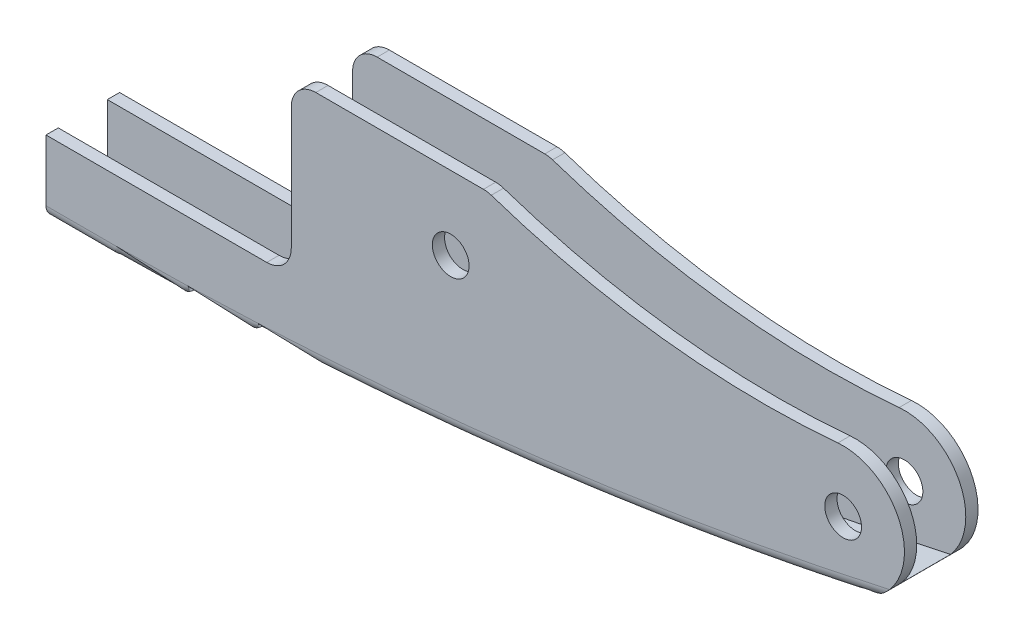
ISO-10303-21;
HEADER;
FILE_DESCRIPTION(('STEP AP214'),'2;1');
FILE_NAME('part.step','',(''),(''),'','','');
FILE_SCHEMA(('AUTOMOTIVE_DESIGN { 1 0 10303 214 1 1 1 1 }'));
ENDSEC;
DATA;
#1=APPLICATION_CONTEXT('core data for automotive mechanical design processes');
#2=APPLICATION_PROTOCOL_DEFINITION('international standard','automotive_design',2000,#1);
#3=PRODUCT_CONTEXT('',#1,'mechanical');
#4=PRODUCT('Part','Part','',(#3));
#5=PRODUCT_RELATED_PRODUCT_CATEGORY('part','',(#4));
#6=PRODUCT_DEFINITION_FORMATION('','',#4);
#7=PRODUCT_DEFINITION_CONTEXT('part definition',#1,'design');
#8=PRODUCT_DEFINITION('design','',#6,#7);
#9=PRODUCT_DEFINITION_SHAPE('','',#8);
#10=(LENGTH_UNIT() NAMED_UNIT(*) SI_UNIT(.MILLI.,.METRE.));
#11=(NAMED_UNIT(*) PLANE_ANGLE_UNIT() SI_UNIT($,.RADIAN.));
#12=(NAMED_UNIT(*) SI_UNIT($,.STERADIAN.) SOLID_ANGLE_UNIT());
#13=UNCERTAINTY_MEASURE_WITH_UNIT(LENGTH_MEASURE(1.E-05),#10,'distance_accuracy_value','');
#14=(GEOMETRIC_REPRESENTATION_CONTEXT(3) GLOBAL_UNCERTAINTY_ASSIGNED_CONTEXT((#13)) GLOBAL_UNIT_ASSIGNED_CONTEXT((#10,
#11,#12)) REPRESENTATION_CONTEXT('',''));
#15=CARTESIAN_POINT('',(0.,0.,0.));
#16=DIRECTION('',(0.,0.,1.));
#17=DIRECTION('',(1.,0.,0.));
#18=AXIS2_PLACEMENT_3D('',#15,#16,#17);
#19=CARTESIAN_POINT('',(12.7640082032885,40.1379256924185,3.));
#20=DIRECTION('',(0.,0.,-1.));
#21=DIRECTION('',(-1.,0.,0.));
#22=AXIS2_PLACEMENT_3D('',#19,#20,#21);
#23=CYLINDRICAL_SURFACE('',#22,35.);
#24=DIRECTION('',(0.,0.,-1.));
#25=VECTOR('',#24,1.);
#26=CARTESIAN_POINT('',(1.65333161323733,6.94827571367831,3.));
#27=LINE('',#26,#25);
#28=CARTESIAN_POINT('',(1.65333161323733,6.94827571367832,0.5));
#29=VERTEX_POINT('',#28);
#30=CARTESIAN_POINT('',(1.65333161323733,6.94827571367831,0.));
#31=VERTEX_POINT('',#30);
#32=EDGE_CURVE('E302',#29,#31,#27,.T.);
#33=ORIENTED_EDGE('',*,*,#32,.F.);
#34=CARTESIAN_POINT('',(12.7640082032885,40.1379256924185,0.5));
#35=DIRECTION('',(0.,0.,-1.));
#36=DIRECTION('',(-1.,0.,0.));
#37=AXIS2_PLACEMENT_3D('',#34,#35,#36);
#38=CIRCLE('',#37,35.);
#39=CARTESIAN_POINT('',(15.7842672135526,5.26848297374406,0.5));
#40=VERTEX_POINT('',#39);
#41=EDGE_CURVE('E220',#29,#40,#38,.F.);
#42=ORIENTED_EDGE('',*,*,#41,.T.);
#43=DIRECTION('',(0.,0.,-1.));
#44=VECTOR('',#43,1.);
#45=CARTESIAN_POINT('',(15.7842672135526,5.26848297374406,3.));
#46=LINE('',#45,#44);
#47=CARTESIAN_POINT('',(15.7842672135526,5.26848297374406,0.));
#48=VERTEX_POINT('',#47);
#49=EDGE_CURVE('E306',#40,#48,#46,.T.);
#50=ORIENTED_EDGE('',*,*,#49,.T.);
#51=CARTESIAN_POINT('',(12.7640082032885,40.1379256924185,0.));
#52=DIRECTION('',(0.,0.,-1.));
#53=DIRECTION('',(1.,0.,0.));
#54=AXIS2_PLACEMENT_3D('',#51,#52,#53);
#55=CIRCLE('',#54,35.);
#56=EDGE_CURVE('E254',#48,#31,#55,.T.);
#57=ORIENTED_EDGE('',*,*,#56,.T.);
#58=EDGE_LOOP('',(#33,#42,#50,#57));
#59=FACE_BOUND('',#58,.T.);
#60=ADVANCED_FACE('F34',(#59),#23,.F.);
#61=CARTESIAN_POINT('',(1.33588371066444,6.,3.));
#62=DIRECTION('',(0.,0.,-1.));
#63=DIRECTION('',(-1.,0.,0.));
#64=AXIS2_PLACEMENT_3D('',#61,#62,#63);
#65=CYLINDRICAL_SURFACE('',#64,1.00000000000002);
#66=DIRECTION('',(0.,0.,-1.));
#67=VECTOR('',#66,1.);
#68=CARTESIAN_POINT('',(1.33588371066444,7.00000000000003,3.));
#69=LINE('',#68,#67);
#70=CARTESIAN_POINT('',(1.33588371066444,7.00000000000003,0.5));
#71=VERTEX_POINT('',#70);
#72=CARTESIAN_POINT('',(1.33588371066444,7.00000000000003,0.));
#73=VERTEX_POINT('',#72);
#74=EDGE_CURVE('E298',#71,#73,#69,.T.);
#75=ORIENTED_EDGE('',*,*,#74,.F.);
#76=CARTESIAN_POINT('',(1.33588371066444,6.,0.5));
#77=DIRECTION('',(0.,0.,-1.));
#78=DIRECTION('',(-1.,0.,0.));
#79=AXIS2_PLACEMENT_3D('',#76,#77,#78);
#80=CIRCLE('',#79,1.00000000000002);
#81=EDGE_CURVE('E412',#71,#29,#80,.T.);
#82=ORIENTED_EDGE('',*,*,#81,.T.);
#83=ORIENTED_EDGE('',*,*,#32,.T.);
#84=CARTESIAN_POINT('',(1.33588371066444,6.,0.));
#85=DIRECTION('',(0.,0.,1.));
#86=DIRECTION('',(1.,0.,0.));
#87=AXIS2_PLACEMENT_3D('',#84,#85,#86);
#88=CIRCLE('',#87,1.00000000000002);
#89=EDGE_CURVE('E257',#31,#73,#88,.T.);
#90=ORIENTED_EDGE('',*,*,#89,.T.);
#91=EDGE_LOOP('',(#75,#82,#83,#90));
#92=FACE_BOUND('',#91,.T.);
#93=ADVANCED_FACE('F393',(#92),#65,.T.);
#94=CARTESIAN_POINT('',(1.33588371066444,7.00000000000003,3.));
#95=DIRECTION('',(0.,-1.,0.));
#96=DIRECTION('',(1.,0.,0.));
#97=AXIS2_PLACEMENT_3D('',#94,#95,#96);
#98=PLANE('',#97);
#99=DIRECTION('',(0.,0.,-1.));
#100=VECTOR('',#99,1.);
#101=CARTESIAN_POINT('',(-5.49999999999998,7.00000000000003,3.));
#102=LINE('',#101,#100);
#103=CARTESIAN_POINT('',(-5.49999999999998,7.00000000000003,0.5));
#104=VERTEX_POINT('',#103);
#105=CARTESIAN_POINT('',(-5.49999999999998,7.00000000000003,0.));
#106=VERTEX_POINT('',#105);
#107=EDGE_CURVE('E294',#104,#106,#102,.T.);
#108=ORIENTED_EDGE('',*,*,#107,.F.);
#109=DIRECTION('',(-1.,0.,0.));
#110=VECTOR('',#109,1.);
#111=CARTESIAN_POINT('',(-22.,7.00000000000003,0.5));
#112=LINE('',#111,#110);
#113=EDGE_CURVE('E454',#71,#104,#112,.T.);
#114=ORIENTED_EDGE('',*,*,#113,.F.);
#115=ORIENTED_EDGE('',*,*,#74,.T.);
#116=DIRECTION('',(-1.,0.,0.));
#117=VECTOR('',#116,1.);
#118=CARTESIAN_POINT('',(1.33588371066444,7.00000000000003,0.));
#119=LINE('',#118,#117);
#120=EDGE_CURVE('E260',#73,#106,#119,.T.);
#121=ORIENTED_EDGE('',*,*,#120,.T.);
#122=EDGE_LOOP('',(#108,#114,#115,#121));
#123=FACE_BOUND('',#122,.T.);
#124=ADVANCED_FACE('F390',(#123),#98,.F.);
#125=CARTESIAN_POINT('',(-5.49999999999998,6.00000000000001,3.));
#126=DIRECTION('',(0.,0.,-1.));
#127=DIRECTION('',(-1.,0.,0.));
#128=AXIS2_PLACEMENT_3D('',#125,#126,#127);
#129=CYLINDRICAL_SURFACE('',#128,1.00000000000002);
#130=DIRECTION('',(0.,0.,-1.));
#131=VECTOR('',#130,1.);
#132=CARTESIAN_POINT('',(-6.5,6.00000000000001,3.));
#133=LINE('',#132,#131);
#134=CARTESIAN_POINT('',(-6.5,6.00000000000001,0.5));
#135=VERTEX_POINT('',#134);
#136=CARTESIAN_POINT('',(-6.5,6.00000000000001,0.));
#137=VERTEX_POINT('',#136);
#138=EDGE_CURVE('E290',#135,#137,#133,.T.);
#139=ORIENTED_EDGE('',*,*,#138,.F.);
#140=CARTESIAN_POINT('',(-5.49999999999998,6.00000000000001,0.5));
#141=DIRECTION('',(0.,0.,-1.));
#142=DIRECTION('',(-1.,0.,0.));
#143=AXIS2_PLACEMENT_3D('',#140,#141,#142);
#144=CIRCLE('',#143,1.00000000000002);
#145=EDGE_CURVE('E415',#135,#104,#144,.T.);
#146=ORIENTED_EDGE('',*,*,#145,.T.);
#147=ORIENTED_EDGE('',*,*,#107,.T.);
#148=CARTESIAN_POINT('',(-5.49999999999998,6.00000000000001,0.));
#149=DIRECTION('',(0.,0.,1.));
#150=DIRECTION('',(1.,0.,0.));
#151=AXIS2_PLACEMENT_3D('',#148,#149,#150);
#152=CIRCLE('',#151,1.00000000000002);
#153=EDGE_CURVE('E263',#106,#137,#152,.T.);
#154=ORIENTED_EDGE('',*,*,#153,.T.);
#155=EDGE_LOOP('',(#139,#146,#147,#154));
#156=FACE_BOUND('',#155,.T.);
#157=ADVANCED_FACE('F386',(#156),#129,.T.);
#158=CARTESIAN_POINT('',(-6.5,6.00000000000001,3.));
#159=DIRECTION('',(1.,0.,0.));
#160=DIRECTION('',(0.,1.,0.));
#161=AXIS2_PLACEMENT_3D('',#158,#159,#160);
#162=PLANE('',#161);
#163=DIRECTION('',(0.,0.,-1.));
#164=VECTOR('',#163,1.);
#165=CARTESIAN_POINT('',(-6.5,1.,3.));
#166=LINE('',#165,#164);
#167=CARTESIAN_POINT('',(-6.5,1.,0.5));
#168=VERTEX_POINT('',#167);
#169=CARTESIAN_POINT('',(-6.5,1.,0.));
#170=VERTEX_POINT('',#169);
#171=EDGE_CURVE('E286',#168,#170,#166,.T.);
#172=ORIENTED_EDGE('',*,*,#171,.F.);
#173=DIRECTION('',(0.,1.,0.));
#174=VECTOR('',#173,1.);
#175=CARTESIAN_POINT('',(-6.5,6.00000000000001,0.5));
#176=LINE('',#175,#174);
#177=EDGE_CURVE('E418',#168,#135,#176,.T.);
#178=ORIENTED_EDGE('',*,*,#177,.T.);
#179=ORIENTED_EDGE('',*,*,#138,.T.);
#180=DIRECTION('',(0.,-1.,0.));
#181=VECTOR('',#180,1.);
#182=CARTESIAN_POINT('',(-6.5,6.00000000000001,0.));
#183=LINE('',#182,#181);
#184=EDGE_CURVE('E266',#137,#170,#183,.T.);
#185=ORIENTED_EDGE('',*,*,#184,.T.);
#186=EDGE_LOOP('',(#172,#178,#179,#185));
#187=FACE_BOUND('',#186,.T.);
#188=ADVANCED_FACE('F381',(#187),#162,.F.);
#189=CARTESIAN_POINT('',(-7.50000000000002,1.,3.));
#190=DIRECTION('',(0.,0.,-1.));
#191=DIRECTION('',(-1.,0.,0.));
#192=AXIS2_PLACEMENT_3D('',#189,#190,#191);
#193=CYLINDRICAL_SURFACE('',#192,1.00000000000002);
#194=DIRECTION('',(0.,0.,-1.));
#195=VECTOR('',#194,1.);
#196=CARTESIAN_POINT('',(-7.50000000000002,0.,3.));
#197=LINE('',#196,#195);
#198=CARTESIAN_POINT('',(-7.50000000000002,0.,0.5));
#199=VERTEX_POINT('',#198);
#200=CARTESIAN_POINT('',(-7.50000000000002,0.,0.));
#201=VERTEX_POINT('',#200);
#202=EDGE_CURVE('E282',#199,#201,#197,.T.);
#203=ORIENTED_EDGE('',*,*,#202,.F.);
#204=CARTESIAN_POINT('',(-7.50000000000002,1.,0.5));
#205=DIRECTION('',(0.,0.,-1.));
#206=DIRECTION('',(-1.,0.,0.));
#207=AXIS2_PLACEMENT_3D('',#204,#205,#206);
#208=CIRCLE('',#207,1.00000000000002);
#209=EDGE_CURVE('E423',#199,#168,#208,.F.);
#210=ORIENTED_EDGE('',*,*,#209,.T.);
#211=ORIENTED_EDGE('',*,*,#171,.T.);
#212=CARTESIAN_POINT('',(-7.50000000000002,1.,0.));
#213=DIRECTION('',(0.,0.,-1.));
#214=DIRECTION('',(-1.,0.,0.));
#215=AXIS2_PLACEMENT_3D('',#212,#213,#214);
#216=CIRCLE('',#215,1.00000000000002);
#217=EDGE_CURVE('E269',#170,#201,#216,.T.);
#218=ORIENTED_EDGE('',*,*,#217,.T.);
#219=EDGE_LOOP('',(#203,#210,#211,#218));
#220=FACE_BOUND('',#219,.T.);
#221=ADVANCED_FACE('F376',(#220),#193,.F.);
#222=CARTESIAN_POINT('',(-7.50000000000002,0.,3.));
#223=DIRECTION('',(0.,-1.,0.));
#224=DIRECTION('',(1.,0.,0.));
#225=AXIS2_PLACEMENT_3D('',#222,#223,#224);
#226=PLANE('',#225);
#227=DIRECTION('',(0.,0.,-1.));
#228=VECTOR('',#227,1.);
#229=CARTESIAN_POINT('',(-16.5,0.,3.));
#230=LINE('',#229,#228);
#231=CARTESIAN_POINT('',(-16.5,0.,0.5));
#232=VERTEX_POINT('',#231);
#233=CARTESIAN_POINT('',(-16.5,0.,0.));
#234=VERTEX_POINT('',#233);
#235=EDGE_CURVE('E278',#232,#234,#230,.T.);
#236=ORIENTED_EDGE('',*,*,#235,.F.);
#237=DIRECTION('',(1.,0.,0.));
#238=VECTOR('',#237,1.);
#239=CARTESIAN_POINT('',(-7.50000000000002,0.,0.5));
#240=LINE('',#239,#238);
#241=EDGE_CURVE('E426',#232,#199,#240,.T.);
#242=ORIENTED_EDGE('',*,*,#241,.T.);
#243=ORIENTED_EDGE('',*,*,#202,.T.);
#244=DIRECTION('',(-1.,0.,0.));
#245=VECTOR('',#244,1.);
#246=CARTESIAN_POINT('',(-7.50000000000002,0.,0.));
#247=LINE('',#246,#245);
#248=EDGE_CURVE('E272',#201,#234,#247,.T.);
#249=ORIENTED_EDGE('',*,*,#248,.T.);
#250=EDGE_LOOP('',(#236,#242,#243,#249));
#251=FACE_BOUND('',#250,.T.);
#252=ADVANCED_FACE('F371',(#251),#226,.F.);
#253=CARTESIAN_POINT('',(0.,4.00000000000003,3.));
#254=DIRECTION('',(0.,0.,-1.));
#255=DIRECTION('',(-1.,0.,0.));
#256=AXIS2_PLACEMENT_3D('',#253,#254,#255);
#257=CYLINDRICAL_SURFACE('',#256,0.749999999999999);
#258=CARTESIAN_POINT('',(0.,4.00000000000003,0.5));
#259=DIRECTION('',(0.,0.,-1.));
#260=DIRECTION('',(-1.,0.,0.));
#261=AXIS2_PLACEMENT_3D('',#258,#259,#260);
#262=CIRCLE('',#261,0.749999999999999);
#263=CARTESIAN_POINT('',(-0.749999999999999,4.00000000000003,0.5));
#264=VERTEX_POINT('',#263);
#265=EDGE_CURVE('E316',#264,#264,#262,.T.);
#266=ORIENTED_EDGE('',*,*,#265,.F.);
#267=EDGE_LOOP('',(#266));
#268=FACE_BOUND('',#267,.T.);
#269=CARTESIAN_POINT('',(0.,4.00000000000003,0.));
#270=DIRECTION('',(0.,0.,1.));
#271=DIRECTION('',(1.,0.,0.));
#272=AXIS2_PLACEMENT_3D('',#269,#270,#271);
#273=CIRCLE('',#272,0.749999999999999);
#274=CARTESIAN_POINT('',(0.749999999999999,4.00000000000003,0.));
#275=VERTEX_POINT('',#274);
#276=EDGE_CURVE('E225',#275,#275,#273,.T.);
#277=ORIENTED_EDGE('',*,*,#276,.F.);
#278=EDGE_LOOP('',(#277));
#279=FACE_BOUND('',#278,.T.);
#280=ADVANCED_FACE('F501',(#268,#279),#257,.F.);
#281=CARTESIAN_POINT('',(16.,2.77780849383874,3.));
#282=DIRECTION('',(0.,0.,-1.));
#283=DIRECTION('',(-1.,0.,0.));
#284=AXIS2_PLACEMENT_3D('',#281,#282,#283);
#285=CYLINDRICAL_SURFACE('',#284,0.749999999999998);
#286=CARTESIAN_POINT('',(16.,2.77780849383874,0.5));
#287=DIRECTION('',(0.,0.,-1.));
#288=DIRECTION('',(-1.,0.,0.));
#289=AXIS2_PLACEMENT_3D('',#286,#287,#288);
#290=CIRCLE('',#289,0.749999999999998);
#291=CARTESIAN_POINT('',(15.25,2.77780849383874,0.5));
#292=VERTEX_POINT('',#291);
#293=EDGE_CURVE('E199',#292,#292,#290,.T.);
#294=ORIENTED_EDGE('',*,*,#293,.F.);
#295=EDGE_LOOP('',(#294));
#296=FACE_BOUND('',#295,.T.);
#297=CARTESIAN_POINT('',(16.,2.77780849383874,0.));
#298=DIRECTION('',(0.,0.,1.));
#299=DIRECTION('',(1.,0.,0.));
#300=AXIS2_PLACEMENT_3D('',#297,#298,#299);
#301=CIRCLE('',#300,0.749999999999998);
#302=CARTESIAN_POINT('',(16.75,2.77780849383874,0.));
#303=VERTEX_POINT('',#302);
#304=EDGE_CURVE('E215',#303,#303,#301,.T.);
#305=ORIENTED_EDGE('',*,*,#304,.F.);
#306=EDGE_LOOP('',(#305));
#307=FACE_BOUND('',#306,.T.);
#308=ADVANCED_FACE('F506',(#296,#307),#285,.F.);
#309=CARTESIAN_POINT('',(-15.1615787135893,148.994107216234,3.));
#310=DIRECTION('',(0.,0.,1.));
#311=DIRECTION('',(1.,0.,0.));
#312=AXIS2_PLACEMENT_3D('',#309,#310,#311);
#313=PLANE('',#312);
#314=CARTESIAN_POINT('',(0.,4.00000000000003,3.));
#315=DIRECTION('',(0.,0.,1.));
#316=DIRECTION('',(1.,0.,0.));
#317=AXIS2_PLACEMENT_3D('',#314,#315,#316);
#318=CIRCLE('',#317,0.749999999999999);
#319=CARTESIAN_POINT('',(0.749999999999999,4.00000000000003,3.));
#320=VERTEX_POINT('',#319);
#321=EDGE_CURVE('E227',#320,#320,#318,.T.);
#322=ORIENTED_EDGE('',*,*,#321,.F.);
#323=EDGE_LOOP('',(#322));
#324=FACE_BOUND('',#323,.T.);
#325=DIRECTION('',(0.,-1.,0.));
#326=VECTOR('',#325,1.);
#327=CARTESIAN_POINT('',(-16.5,0.,3.));
#328=LINE('',#327,#326);
#329=CARTESIAN_POINT('',(-16.5,0.,3.));
#330=VERTEX_POINT('',#329);
#331=CARTESIAN_POINT('',(-16.5,-2.499980551111,3.));
#332=VERTEX_POINT('',#331);
#333=EDGE_CURVE('E250',#330,#332,#328,.T.);
#334=ORIENTED_EDGE('',*,*,#333,.T.);
#335=CARTESIAN_POINT('',(-15.1615787135893,148.994107216234,3.));
#336=DIRECTION('',(0.,0.,1.));
#337=DIRECTION('',(1.,0.,0.));
#338=AXIS2_PLACEMENT_3D('',#335,#336,#337);
#339=CIRCLE('',#338,151.5);
#340=CARTESIAN_POINT('',(17.8921240772023,1.14383588804895,3.));
#341=VERTEX_POINT('',#340);
#342=EDGE_CURVE('E12',#332,#341,#339,.T.);
#343=ORIENTED_EDGE('',*,*,#342,.T.);
#344=CARTESIAN_POINT('',(16.,2.77780849383874,3.));
#345=DIRECTION('',(0.,0.,1.));
#346=DIRECTION('',(1.,0.,0.));
#347=AXIS2_PLACEMENT_3D('',#344,#345,#346);
#348=CIRCLE('',#347,2.5);
#349=CARTESIAN_POINT('',(15.7842672135526,5.26848297374406,3.));
#350=VERTEX_POINT('',#349);
#351=EDGE_CURVE('E233',#341,#350,#348,.T.);
#352=ORIENTED_EDGE('',*,*,#351,.T.);
#353=CARTESIAN_POINT('',(12.7640082032885,40.1379256924185,3.));
#354=DIRECTION('',(0.,0.,-1.));
#355=DIRECTION('',(1.,0.,0.));
#356=AXIS2_PLACEMENT_3D('',#353,#354,#355);
#357=CIRCLE('',#356,35.);
#358=CARTESIAN_POINT('',(1.65333161323733,6.94827571367831,3.));
#359=VERTEX_POINT('',#358);
#360=EDGE_CURVE('E235',#350,#359,#357,.T.);
#361=ORIENTED_EDGE('',*,*,#360,.T.);
#362=CARTESIAN_POINT('',(1.33588371066444,6.,3.));
#363=DIRECTION('',(0.,0.,1.));
#364=DIRECTION('',(1.,0.,0.));
#365=AXIS2_PLACEMENT_3D('',#362,#363,#364);
#366=CIRCLE('',#365,1.00000000000002);
#367=CARTESIAN_POINT('',(1.33588371066444,7.00000000000003,3.));
#368=VERTEX_POINT('',#367);
#369=EDGE_CURVE('E238',#359,#368,#366,.T.);
#370=ORIENTED_EDGE('',*,*,#369,.T.);
#371=DIRECTION('',(-1.,0.,0.));
#372=VECTOR('',#371,1.);
#373=CARTESIAN_POINT('',(1.33588371066444,7.00000000000003,3.));
#374=LINE('',#373,#372);
#375=CARTESIAN_POINT('',(-5.49999999999998,7.00000000000003,3.));
#376=VERTEX_POINT('',#375);
#377=EDGE_CURVE('E240',#368,#376,#374,.T.);
#378=ORIENTED_EDGE('',*,*,#377,.T.);
#379=CARTESIAN_POINT('',(-5.49999999999998,6.00000000000001,3.));
#380=DIRECTION('',(0.,0.,1.));
#381=DIRECTION('',(1.,0.,0.));
#382=AXIS2_PLACEMENT_3D('',#379,#380,#381);
#383=CIRCLE('',#382,1.00000000000002);
#384=CARTESIAN_POINT('',(-6.5,6.00000000000001,3.));
#385=VERTEX_POINT('',#384);
#386=EDGE_CURVE('E242',#376,#385,#383,.T.);
#387=ORIENTED_EDGE('',*,*,#386,.T.);
#388=DIRECTION('',(0.,-1.,0.));
#389=VECTOR('',#388,1.);
#390=CARTESIAN_POINT('',(-6.5,6.00000000000001,3.));
#391=LINE('',#390,#389);
#392=CARTESIAN_POINT('',(-6.5,1.,3.));
#393=VERTEX_POINT('',#392);
#394=EDGE_CURVE('E244',#385,#393,#391,.T.);
#395=ORIENTED_EDGE('',*,*,#394,.T.);
#396=CARTESIAN_POINT('',(-7.50000000000002,1.,3.));
#397=DIRECTION('',(0.,0.,-1.));
#398=DIRECTION('',(-1.,0.,0.));
#399=AXIS2_PLACEMENT_3D('',#396,#397,#398);
#400=CIRCLE('',#399,1.00000000000002);
#401=CARTESIAN_POINT('',(-7.50000000000002,0.,3.));
#402=VERTEX_POINT('',#401);
#403=EDGE_CURVE('E246',#393,#402,#400,.T.);
#404=ORIENTED_EDGE('',*,*,#403,.T.);
#405=DIRECTION('',(-1.,0.,0.));
#406=VECTOR('',#405,1.);
#407=CARTESIAN_POINT('',(-7.50000000000002,0.,3.));
#408=LINE('',#407,#406);
#409=EDGE_CURVE('E248',#402,#330,#408,.T.);
#410=ORIENTED_EDGE('',*,*,#409,.T.);
#411=EDGE_LOOP('',(#334,#343,#352,#361,#370,#378,#387,#395,#404,#410));
#412=FACE_BOUND('',#411,.T.);
#413=CARTESIAN_POINT('',(16.,2.77780849383874,3.));
#414=DIRECTION('',(0.,0.,1.));
#415=DIRECTION('',(1.,0.,0.));
#416=AXIS2_PLACEMENT_3D('',#413,#414,#415);
#417=CIRCLE('',#416,0.749999999999998);
#418=CARTESIAN_POINT('',(16.75,2.77780849383874,3.));
#419=VERTEX_POINT('',#418);
#420=EDGE_CURVE('E218',#419,#419,#417,.T.);
#421=ORIENTED_EDGE('',*,*,#420,.F.);
#422=EDGE_LOOP('',(#421));
#423=FACE_BOUND('',#422,.T.);
#424=ADVANCED_FACE('F479',(#324,#412,#423),#313,.T.);
#425=CARTESIAN_POINT('',(-15.1615787135893,148.994107216234,0.));
#426=DIRECTION('',(0.,0.,1.));
#427=DIRECTION('',(1.,0.,0.));
#428=AXIS2_PLACEMENT_3D('',#425,#426,#427);
#429=PLANE('',#428);
#430=ORIENTED_EDGE('',*,*,#276,.T.);
#431=EDGE_LOOP('',(#430));
#432=FACE_BOUND('',#431,.T.);
#433=CARTESIAN_POINT('',(16.,2.77780849383874,0.));
#434=DIRECTION('',(0.,0.,1.));
#435=DIRECTION('',(1.,0.,0.));
#436=AXIS2_PLACEMENT_3D('',#433,#434,#435);
#437=CIRCLE('',#436,2.5);
#438=CARTESIAN_POINT('',(17.8921240772023,1.14383588804895,0.));
#439=VERTEX_POINT('',#438);
#440=EDGE_CURVE('E230',#439,#48,#437,.T.);
#441=ORIENTED_EDGE('',*,*,#440,.F.);
#442=CARTESIAN_POINT('',(-15.1615787135893,148.994107216234,0.));
#443=DIRECTION('',(0.,0.,1.));
#444=DIRECTION('',(1.,0.,0.));
#445=AXIS2_PLACEMENT_3D('',#442,#443,#444);
#446=CIRCLE('',#445,151.5);
#447=CARTESIAN_POINT('',(-16.5,-2.499980551111,0.));
#448=VERTEX_POINT('',#447);
#449=EDGE_CURVE('E58',#439,#448,#446,.F.);
#450=ORIENTED_EDGE('',*,*,#449,.T.);
#451=DIRECTION('',(0.,-1.,0.));
#452=VECTOR('',#451,1.);
#453=CARTESIAN_POINT('',(-16.5,0.,0.));
#454=LINE('',#453,#452);
#455=EDGE_CURVE('E236',#234,#448,#454,.T.);
#456=ORIENTED_EDGE('',*,*,#455,.F.);
#457=ORIENTED_EDGE('',*,*,#248,.F.);
#458=ORIENTED_EDGE('',*,*,#217,.F.);
#459=ORIENTED_EDGE('',*,*,#184,.F.);
#460=ORIENTED_EDGE('',*,*,#153,.F.);
#461=ORIENTED_EDGE('',*,*,#120,.F.);
#462=ORIENTED_EDGE('',*,*,#89,.F.);
#463=ORIENTED_EDGE('',*,*,#56,.F.);
#464=EDGE_LOOP('',(#441,#450,#456,#457,#458,#459,#460,#461,#462,#463));
#465=FACE_BOUND('',#464,.T.);
#466=ORIENTED_EDGE('',*,*,#304,.T.);
#467=EDGE_LOOP('',(#466));
#468=FACE_BOUND('',#467,.T.);
#469=ADVANCED_FACE('F343',(#432,#465,#468),#429,.F.);
#470=CARTESIAN_POINT('',(-15.1615787135893,148.994107216234,3.));
#471=DIRECTION('',(0.,0.,-1.));
#472=DIRECTION('',(-1.,0.,0.));
#473=AXIS2_PLACEMENT_3D('',#470,#471,#472);
#474=CYLINDRICAL_SURFACE('',#473,152.);
#475=DIRECTION('',(0.,0.,-1.));
#476=VECTOR('',#475,1.);
#477=CARTESIAN_POINT('',(-16.5,-3.,3.));
#478=LINE('',#477,#476);
#479=CARTESIAN_POINT('',(-16.5,-3.,2.5));
#480=VERTEX_POINT('',#479);
#481=CARTESIAN_POINT('',(-16.5,-3.,0.5));
#482=VERTEX_POINT('',#481);
#483=EDGE_CURVE('E252',#480,#482,#478,.T.);
#484=ORIENTED_EDGE('',*,*,#483,.T.);
#485=CARTESIAN_POINT('',(-15.1615787135893,148.994107216234,0.5));
#486=DIRECTION('',(0.,0.,1.));
#487=DIRECTION('',(1.,0.,0.));
#488=AXIS2_PLACEMENT_3D('',#485,#486,#487);
#489=CIRCLE('',#488,152.);
#490=CARTESIAN_POINT('',(16.5210966340065,0.332719886440828,0.5));
#491=VERTEX_POINT('',#490);
#492=EDGE_CURVE('E320',#482,#491,#489,.T.);
#493=ORIENTED_EDGE('',*,*,#492,.T.);
#494=DIRECTION('',(0.,0.,-1.));
#495=VECTOR('',#494,1.);
#496=CARTESIAN_POINT('',(16.5210966340065,0.332719886440828,3.));
#497=LINE('',#496,#495);
#498=CARTESIAN_POINT('',(16.5210966340065,0.332719886440828,2.5));
#499=VERTEX_POINT('',#498);
#500=EDGE_CURVE('E309',#499,#491,#497,.T.);
#501=ORIENTED_EDGE('',*,*,#500,.F.);
#502=CARTESIAN_POINT('',(-15.1615787135893,148.994107216234,2.5));
#503=DIRECTION('',(0.,0.,1.));
#504=DIRECTION('',(1.,0.,0.));
#505=AXIS2_PLACEMENT_3D('',#502,#503,#504);
#506=CIRCLE('',#505,152.);
#507=EDGE_CURVE('E318',#499,#480,#506,.F.);
#508=ORIENTED_EDGE('',*,*,#507,.T.);
#509=EDGE_LOOP('',(#484,#493,#501,#508));
#510=FACE_BOUND('',#509,.T.);
#511=ADVANCED_FACE('F339',(#510),#474,.T.);
#512=CARTESIAN_POINT('',(16.,2.77780849383874,3.));
#513=DIRECTION('',(0.,0.,-1.));
#514=DIRECTION('',(-1.,0.,0.));
#515=AXIS2_PLACEMENT_3D('',#512,#513,#514);
#516=CYLINDRICAL_SURFACE('',#515,2.5);
#517=ORIENTED_EDGE('',*,*,#500,.T.);
#518=CARTESIAN_POINT('',(17.8921240772023,1.14383588804888,0.));
#519=CARTESIAN_POINT('',(17.8661472342054,1.11374690952603,1.89264214271771E-05));
#520=CARTESIAN_POINT('',(17.8394723562101,1.08431587865306,0.0016825050942288));
#521=CARTESIAN_POINT('',(17.7849557999185,1.02695493388523,0.00779420182890719));
#522=CARTESIAN_POINT('',(17.7571164174433,0.999022293182348,0.012237061554263));
#523=CARTESIAN_POINT('',(17.700589363783,0.944909386598606,0.0233692571391493));
#524=CARTESIAN_POINT('',(17.6719085650823,0.91871870240744,0.0300434570089775));
#525=CARTESIAN_POINT('',(17.6136353619444,0.867919497276853,0.0452757999174147));
#526=CARTESIAN_POINT('',(17.5840423726586,0.843312023986455,0.0538351741863413));
#527=CARTESIAN_POINT('',(17.5051723884155,0.780723551727106,0.0784008227628452));
#528=CARTESIAN_POINT('',(17.4552329816929,0.744076979969206,0.0957027450201746));
#529=CARTESIAN_POINT('',(17.3536084797144,0.675066914733464,0.133383259765773));
#530=CARTESIAN_POINT('',(17.3019226640707,0.642705216506074,0.15376313422901));
#531=CARTESIAN_POINT('',(17.1442415174443,0.551720326617975,0.21842795152308));
#532=CARTESIAN_POINT('',(17.0359172757513,0.49942814670216,0.266136723618371));
#533=CARTESIAN_POINT('',(16.8608754192518,0.429676250194396,0.34498618914375));
#534=CARTESIAN_POINT('',(16.7955892010653,0.406774559505871,0.374765967656888));
#535=CARTESIAN_POINT('',(16.6637568893351,0.366551237871222,0.435002320125371));
#536=CARTESIAN_POINT('',(16.5972136841777,0.349218151826239,0.46545736514515));
#537=CARTESIAN_POINT('',(16.5271053391207,0.334006251553056,0.49727463326887));
#538=CARTESIAN_POINT('',(16.5241015436862,0.333360292650773,0.498637333622171));
#539=CARTESIAN_POINT('',(16.5210966340065,0.33271988644083,0.5));
#540=B_SPLINE_CURVE_WITH_KNOTS('',3,(#518,#519,#520,#521,#522,#523,#524,#525,#526,#527,#528,
#529,#530,#531,#532,#533,#534,#535,#536,#537,#538,#539),.UNSPECIFIED.,.F.,.F.,(4,2,2,2,2,2,2,2,
2,2,4),(0.,0.119148236942997,0.238071727100649,0.356204352886515,0.474414362531233,
0.66705000541344,0.859766103933554,1.24634899461732,1.47216446302084,1.69751239021152,
1.70759566992591),.UNSPECIFIED.);
#541=EDGE_CURVE('E329',#491,#439,#540,.F.);
#542=ORIENTED_EDGE('',*,*,#541,.T.);
#543=ORIENTED_EDGE('',*,*,#440,.T.);
#544=ORIENTED_EDGE('',*,*,#49,.F.);
#545=CARTESIAN_POINT('',(16.,2.77780849383874,0.5));
#546=DIRECTION('',(0.,0.,-1.));
#547=DIRECTION('',(-1.,0.,0.));
#548=AXIS2_PLACEMENT_3D('',#545,#546,#547);
#549=CIRCLE('',#548,2.5);
#550=CARTESIAN_POINT('',(17.8788379458635,1.12857595317511,0.5));
#551=VERTEX_POINT('',#550);
#552=EDGE_CURVE('E214',#40,#551,#549,.T.);
#553=ORIENTED_EDGE('',*,*,#552,.T.);
#554=DIRECTION('',(0.,0.,-1.));
#555=VECTOR('',#554,1.);
#556=CARTESIAN_POINT('',(17.8788379458634,1.12857595317509,1.5));
#557=LINE('',#556,#555);
#558=CARTESIAN_POINT('',(17.8788379458635,1.12857595317511,2.5));
#559=VERTEX_POINT('',#558);
#560=EDGE_CURVE('E203',#559,#551,#557,.T.);
#561=ORIENTED_EDGE('',*,*,#560,.F.);
#562=CARTESIAN_POINT('',(16.,2.77780849383874,2.5));
#563=DIRECTION('',(0.,0.,1.));
#564=DIRECTION('',(1.,0.,0.));
#565=AXIS2_PLACEMENT_3D('',#562,#563,#564);
#566=CIRCLE('',#565,2.5);
#567=CARTESIAN_POINT('',(15.7842672135526,5.26848297374406,2.5));
#568=VERTEX_POINT('',#567);
#569=EDGE_CURVE('E188',#559,#568,#566,.T.);
#570=ORIENTED_EDGE('',*,*,#569,.T.);
#571=EDGE_CURVE('E307',#350,#568,#46,.T.);
#572=ORIENTED_EDGE('',*,*,#571,.F.);
#573=ORIENTED_EDGE('',*,*,#351,.F.);
#574=CARTESIAN_POINT('',(17.8921240772023,1.14383588804888,3.));
#575=CARTESIAN_POINT('',(17.8661472342052,1.11374690952586,2.99998107357857));
#576=CARTESIAN_POINT('',(17.8394723562098,1.08431587865273,2.99831749490575));
#577=CARTESIAN_POINT('',(17.7849557999179,1.02695493388458,2.99220579817101));
#578=CARTESIAN_POINT('',(17.7571164174425,0.999022293181545,2.9877629384456));
#579=CARTESIAN_POINT('',(17.7005893637821,0.944909386597831,2.97663074286066));
#580=CARTESIAN_POINT('',(17.6719085650816,0.91871870240683,2.96995654299084));
#581=CARTESIAN_POINT('',(17.6136353619441,0.867919497276561,2.95472420008247));
#582=CARTESIAN_POINT('',(17.5840423726584,0.843312023986314,2.94616482581359));
#583=CARTESIAN_POINT('',(17.5051723884156,0.7807235517272,2.92159917723722));
#584=CARTESIAN_POINT('',(17.4552329816931,0.74407697996938,2.90429725498001));
#585=CARTESIAN_POINT('',(17.353608479715,0.67506691473379,2.86661674023433));
#586=CARTESIAN_POINT('',(17.3019226640714,0.642705216506475,2.8462368657709));
#587=CARTESIAN_POINT('',(17.1442415174445,0.551720326618152,2.78157204847778));
#588=CARTESIAN_POINT('',(17.03591727575,0.499428146701921,2.73386327638533));
#589=CARTESIAN_POINT('',(16.8608754192527,0.429676250194588,2.65501381085415));
#590=CARTESIAN_POINT('',(16.795589201068,0.406774559506467,2.62523403233668));
#591=CARTESIAN_POINT('',(16.6637568893324,0.366551237870641,2.56499767988081));
#592=CARTESIAN_POINT('',(16.5972136841677,0.349218151824079,2.53454263487792));
#593=CARTESIAN_POINT('',(16.5271053391198,0.334006251552872,2.50272536673317));
#594=CARTESIAN_POINT('',(16.5241015436858,0.333360292650677,2.50136266637889));
#595=CARTESIAN_POINT('',(16.5210966340065,0.33271988644083,2.5));
#596=B_SPLINE_CURVE_WITH_KNOTS('',3,(#574,#575,#576,#577,#578,#579,#580,#581,#582,#583,#584,
#585,#586,#587,#588,#589,#590,#591,#592,#593,#594,#595),.UNSPECIFIED.,.F.,.F.,(4,2,2,2,2,2,2,2,
2,2,4),(0.,0.119148236943669,0.238071727102032,0.356204352887221,0.474414362531232,
0.667050005412955,0.859766103932677,1.24634899461732,1.47216446302089,1.69751239021147,
1.70759566992591),.UNSPECIFIED.);
#597=EDGE_CURVE('E323',#341,#499,#596,.T.);
#598=ORIENTED_EDGE('',*,*,#597,.T.);
#599=EDGE_LOOP('',(#517,#542,#543,#544,#553,#561,#570,#572,#573,#598));
#600=FACE_BOUND('',#599,.T.);
#601=ADVANCED_FACE('F212',(#600),#516,.T.);
#602=ORIENTED_EDGE('',*,*,#571,.T.);
#603=CARTESIAN_POINT('',(12.7640082032885,40.1379256924185,2.5));
#604=DIRECTION('',(0.,0.,1.));
#605=DIRECTION('',(1.,0.,0.));
#606=AXIS2_PLACEMENT_3D('',#603,#604,#605);
#607=CIRCLE('',#606,35.);
#608=CARTESIAN_POINT('',(1.65333161323733,6.94827571367832,2.5));
#609=VERTEX_POINT('',#608);
#610=EDGE_CURVE('E194',#568,#609,#607,.F.);
#611=ORIENTED_EDGE('',*,*,#610,.T.);
#612=EDGE_CURVE('E303',#359,#609,#27,.T.);
#613=ORIENTED_EDGE('',*,*,#612,.F.);
#614=ORIENTED_EDGE('',*,*,#360,.F.);
#615=EDGE_LOOP('',(#602,#611,#613,#614));
#616=FACE_BOUND('',#615,.T.);
#617=ADVANCED_FACE('F338',(#616),#23,.F.);
#618=ORIENTED_EDGE('',*,*,#612,.T.);
#619=CARTESIAN_POINT('',(1.33588371066444,6.,2.5));
#620=DIRECTION('',(0.,0.,1.));
#621=DIRECTION('',(1.,0.,0.));
#622=AXIS2_PLACEMENT_3D('',#619,#620,#621);
#623=CIRCLE('',#622,1.00000000000002);
#624=CARTESIAN_POINT('',(1.33588371066444,7.00000000000003,2.5));
#625=VERTEX_POINT('',#624);
#626=EDGE_CURVE('E435',#609,#625,#623,.T.);
#627=ORIENTED_EDGE('',*,*,#626,.T.);
#628=EDGE_CURVE('E299',#368,#625,#69,.T.);
#629=ORIENTED_EDGE('',*,*,#628,.F.);
#630=ORIENTED_EDGE('',*,*,#369,.F.);
#631=EDGE_LOOP('',(#618,#627,#629,#630));
#632=FACE_BOUND('',#631,.T.);
#633=ADVANCED_FACE('F388',(#632),#65,.T.);
#634=ORIENTED_EDGE('',*,*,#628,.T.);
#635=DIRECTION('',(1.,0.,0.));
#636=VECTOR('',#635,1.);
#637=CARTESIAN_POINT('',(-22.,7.00000000000003,2.5));
#638=LINE('',#637,#636);
#639=CARTESIAN_POINT('',(-5.49999999999998,7.00000000000003,2.5));
#640=VERTEX_POINT('',#639);
#641=EDGE_CURVE('E456',#640,#625,#638,.T.);
#642=ORIENTED_EDGE('',*,*,#641,.F.);
#643=EDGE_CURVE('E295',#376,#640,#102,.T.);
#644=ORIENTED_EDGE('',*,*,#643,.F.);
#645=ORIENTED_EDGE('',*,*,#377,.F.);
#646=EDGE_LOOP('',(#634,#642,#644,#645));
#647=FACE_BOUND('',#646,.T.);
#648=ADVANCED_FACE('F384',(#647),#98,.F.);
#649=ORIENTED_EDGE('',*,*,#643,.T.);
#650=CARTESIAN_POINT('',(-5.49999999999998,6.00000000000001,2.5));
#651=DIRECTION('',(0.,0.,1.));
#652=DIRECTION('',(1.,0.,0.));
#653=AXIS2_PLACEMENT_3D('',#650,#651,#652);
#654=CIRCLE('',#653,1.00000000000002);
#655=CARTESIAN_POINT('',(-6.5,6.00000000000001,2.5));
#656=VERTEX_POINT('',#655);
#657=EDGE_CURVE('E438',#640,#656,#654,.T.);
#658=ORIENTED_EDGE('',*,*,#657,.T.);
#659=EDGE_CURVE('E291',#385,#656,#133,.T.);
#660=ORIENTED_EDGE('',*,*,#659,.F.);
#661=ORIENTED_EDGE('',*,*,#386,.F.);
#662=EDGE_LOOP('',(#649,#658,#660,#661));
#663=FACE_BOUND('',#662,.T.);
#664=ADVANCED_FACE('F379',(#663),#129,.T.);
#665=ORIENTED_EDGE('',*,*,#659,.T.);
#666=DIRECTION('',(0.,-1.,0.));
#667=VECTOR('',#666,1.);
#668=CARTESIAN_POINT('',(-6.5,6.00000000000001,2.5));
#669=LINE('',#668,#667);
#670=CARTESIAN_POINT('',(-6.5,1.,2.5));
#671=VERTEX_POINT('',#670);
#672=EDGE_CURVE('E441',#656,#671,#669,.T.);
#673=ORIENTED_EDGE('',*,*,#672,.T.);
#674=EDGE_CURVE('E287',#393,#671,#166,.T.);
#675=ORIENTED_EDGE('',*,*,#674,.F.);
#676=ORIENTED_EDGE('',*,*,#394,.F.);
#677=EDGE_LOOP('',(#665,#673,#675,#676));
#678=FACE_BOUND('',#677,.T.);
#679=ADVANCED_FACE('F374',(#678),#162,.F.);
#680=ORIENTED_EDGE('',*,*,#674,.T.);
#681=CARTESIAN_POINT('',(-7.50000000000002,1.,2.5));
#682=DIRECTION('',(0.,0.,1.));
#683=DIRECTION('',(1.,0.,0.));
#684=AXIS2_PLACEMENT_3D('',#681,#682,#683);
#685=CIRCLE('',#684,1.00000000000002);
#686=CARTESIAN_POINT('',(-7.50000000000002,0.,2.5));
#687=VERTEX_POINT('',#686);
#688=EDGE_CURVE('E444',#671,#687,#685,.F.);
#689=ORIENTED_EDGE('',*,*,#688,.T.);
#690=EDGE_CURVE('E283',#402,#687,#197,.T.);
#691=ORIENTED_EDGE('',*,*,#690,.F.);
#692=ORIENTED_EDGE('',*,*,#403,.F.);
#693=EDGE_LOOP('',(#680,#689,#691,#692));
#694=FACE_BOUND('',#693,.T.);
#695=ADVANCED_FACE('F369',(#694),#193,.F.);
#696=ORIENTED_EDGE('',*,*,#690,.T.);
#697=DIRECTION('',(-1.,0.,0.));
#698=VECTOR('',#697,1.);
#699=CARTESIAN_POINT('',(-7.50000000000002,0.,2.5));
#700=LINE('',#699,#698);
#701=CARTESIAN_POINT('',(-16.5,0.,2.5));
#702=VERTEX_POINT('',#701);
#703=EDGE_CURVE('E447',#687,#702,#700,.T.);
#704=ORIENTED_EDGE('',*,*,#703,.T.);
#705=EDGE_CURVE('E279',#330,#702,#230,.T.);
#706=ORIENTED_EDGE('',*,*,#705,.F.);
#707=ORIENTED_EDGE('',*,*,#409,.F.);
#708=EDGE_LOOP('',(#696,#704,#706,#707));
#709=FACE_BOUND('',#708,.T.);
#710=ADVANCED_FACE('F364',(#709),#226,.F.);
#711=CARTESIAN_POINT('',(-16.5,0.,3.));
#712=DIRECTION('',(1.,0.,0.));
#713=DIRECTION('',(0.,0.,-1.));
#714=AXIS2_PLACEMENT_3D('',#711,#712,#713);
#715=PLANE('',#714);
#716=ORIENTED_EDGE('',*,*,#455,.T.);
#717=CARTESIAN_POINT('',(-16.5,-2.499980551111,0.));
#718=CARTESIAN_POINT('',(-16.5,-2.52811158672559,-2.38871277689081E-05));
#719=CARTESIAN_POINT('',(-16.5,-2.55623549128955,0.00237245162543082));
#720=CARTESIAN_POINT('',(-16.5,-2.61166627351936,0.0118293212823411));
#721=CARTESIAN_POINT('',(-16.5,-2.63897377359375,0.0188861991439828));
#722=CARTESIAN_POINT('',(-16.5,-2.69202822456437,0.0374928648780822));
#723=CARTESIAN_POINT('',(-16.5,-2.71777441883783,0.0490448113049409));
#724=CARTESIAN_POINT('',(-16.5,-2.76695780629253,0.0763036748108299));
#725=CARTESIAN_POINT('',(-16.5,-2.79039540602042,0.0920098585212077));
#726=CARTESIAN_POINT('',(-16.5,-2.83430053698443,0.127133702964048));
#727=CARTESIAN_POINT('',(-16.5,-2.8547681488103,0.146551262956244));
#728=CARTESIAN_POINT('',(-16.5,-2.89215692736153,0.188551555776015));
#729=CARTESIAN_POINT('',(-16.5,-2.90907739979103,0.211134906815791));
#730=CARTESIAN_POINT('',(-16.5,-2.93888821860753,0.258823293809035));
#731=CARTESIAN_POINT('',(-16.5,-2.95177792402831,0.283928729982714));
#732=CARTESIAN_POINT('',(-16.5,-2.97315268856546,0.335942373429623));
#733=CARTESIAN_POINT('',(-16.5,-2.98164033021738,0.362849513220599));
#734=CARTESIAN_POINT('',(-16.5,-2.99186001421198,0.408267847012018));
#735=CARTESIAN_POINT('',(-16.5,-2.99491066416288,0.426493256666106));
#736=CARTESIAN_POINT('',(-16.5,-2.99898038802383,0.46314323000429));
#737=CARTESIAN_POINT('',(-16.5,-3.00000234173318,0.481567474001935));
#738=CARTESIAN_POINT('',(-16.5,-2.99999999999999,0.500000000000003));
#739=B_SPLINE_CURVE_WITH_KNOTS('',3,(#717,#718,#719,#720,#721,#722,#723,#724,#725,#726,#727,
#728,#729,#730,#731,#732,#733,#734,#735,#736,#737,#738),.UNSPECIFIED.,.F.,.F.,(4,2,2,2,2,2,2,2,
2,2,4),(0.,0.0842810077438258,0.168496032297617,0.25275154733378,0.336992198231035,
0.421230562854925,0.505485400429111,0.589753629269761,0.673972364832218,0.729304110394124,
0.784557254443688),.UNSPECIFIED.);
#740=EDGE_CURVE('E43',#448,#482,#739,.T.);
#741=ORIENTED_EDGE('',*,*,#740,.T.);
#742=ORIENTED_EDGE('',*,*,#483,.F.);
#743=CARTESIAN_POINT('',(-16.5,-3.,2.5));
#744=CARTESIAN_POINT('',(-16.5,-3.00002389536127,2.52812835608096));
#745=CARTESIAN_POINT('',(-16.5,-2.99762772419176,2.55624956826044));
#746=CARTESIAN_POINT('',(-16.5,-2.98817158540357,2.61167495761785));
#747=CARTESIAN_POINT('',(-16.5,-2.98111528096471,2.63897975894242));
#748=CARTESIAN_POINT('',(-16.5,-2.96251024064127,2.69202892880065));
#749=CARTESIAN_POINT('',(-16.5,-2.95095934986757,2.71777254198326));
#750=CARTESIAN_POINT('',(-16.5,-2.92370315726282,2.76695108554798));
#751=CARTESIAN_POINT('',(-16.5,-2.90799858609429,2.79038642097882));
#752=CARTESIAN_POINT('',(-16.5,-2.8728779698857,2.83428831639711));
#753=CARTESIAN_POINT('',(-16.5,-2.85346189734586,2.85475485438574));
#754=CARTESIAN_POINT('',(-16.5,-2.81146496818849,2.89214203886074));
#755=CARTESIAN_POINT('',(-16.5,-2.78888349297821,2.90906199064569));
#756=CARTESIAN_POINT('',(-16.5,-2.74119741886424,2.93887366897919));
#757=CARTESIAN_POINT('',(-16.5,-2.71609223519719,2.95176445908237));
#758=CARTESIAN_POINT('',(-16.5,-2.66407900595888,2.97314176309394));
#759=CARTESIAN_POINT('',(-16.5,-2.63717202589457,2.98163085446091));
#760=CARTESIAN_POINT('',(-16.5,-2.59174717334523,2.99185480464047));
#761=CARTESIAN_POINT('',(-16.5,-2.57351498657203,2.99490740688575));
#762=CARTESIAN_POINT('',(-16.5,-2.53685126378923,2.99897973647453));
#763=CARTESIAN_POINT('',(-16.5,-2.51842004774142,3.00000234533239));
#764=CARTESIAN_POINT('',(-16.5,-2.499980551111,3.));
#765=B_SPLINE_CURVE_WITH_KNOTS('',3,(#743,#744,#745,#746,#747,#748,#749,#750,#751,#752,#753,
#754,#755,#756,#757,#758,#759,#760,#761,#762,#763,#764),.UNSPECIFIED.,.F.,.F.,(4,2,2,2,2,2,2,2,
2,2,4),(0.,0.0842729527898964,0.168479740063053,0.25272694936856,0.336959348823647,
0.421192372409534,0.505441880080692,0.589710954228123,0.673930627894797,0.729283288963267,
0.784557322255792),.UNSPECIFIED.);
#766=EDGE_CURVE('E50',#480,#332,#765,.T.);
#767=ORIENTED_EDGE('',*,*,#766,.T.);
#768=ORIENTED_EDGE('',*,*,#333,.F.);
#769=ORIENTED_EDGE('',*,*,#705,.T.);
#770=DIRECTION('',(0.,-1.,0.));
#771=VECTOR('',#770,1.);
#772=CARTESIAN_POINT('',(-16.5,0.,2.5));
#773=LINE('',#772,#771);
#774=CARTESIAN_POINT('',(-16.5,-2.5,2.5));
#775=VERTEX_POINT('',#774);
#776=EDGE_CURVE('E450',#702,#775,#773,.T.);
#777=ORIENTED_EDGE('',*,*,#776,.T.);
#778=DIRECTION('',(0.,0.,-1.));
#779=VECTOR('',#778,1.);
#780=CARTESIAN_POINT('',(-16.5,-2.5,3.));
#781=LINE('',#780,#779);
#782=CARTESIAN_POINT('',(-16.5,-2.5,0.5));
#783=VERTEX_POINT('',#782);
#784=EDGE_CURVE('E206',#783,#775,#781,.F.);
#785=ORIENTED_EDGE('',*,*,#784,.F.);
#786=DIRECTION('',(0.,1.,0.));
#787=VECTOR('',#786,1.);
#788=CARTESIAN_POINT('',(-16.5,0.,0.5));
#789=LINE('',#788,#787);
#790=EDGE_CURVE('E429',#783,#232,#789,.T.);
#791=ORIENTED_EDGE('',*,*,#790,.T.);
#792=ORIENTED_EDGE('',*,*,#235,.T.);
#793=EDGE_LOOP('',(#716,#741,#742,#767,#768,#769,#777,#785,#791,#792));
#794=FACE_BOUND('',#793,.T.);
#795=ADVANCED_FACE('F358',(#794),#715,.F.);
#796=CARTESIAN_POINT('',(0.,4.00000000000003,2.5));
#797=DIRECTION('',(0.,0.,1.));
#798=DIRECTION('',(1.,0.,0.));
#799=AXIS2_PLACEMENT_3D('',#796,#797,#798);
#800=CIRCLE('',#799,0.749999999999999);
#801=CARTESIAN_POINT('',(0.749999999999999,4.00000000000003,2.5));
#802=VERTEX_POINT('',#801);
#803=EDGE_CURVE('E313',#802,#802,#800,.T.);
#804=ORIENTED_EDGE('',*,*,#803,.F.);
#805=EDGE_LOOP('',(#804));
#806=FACE_BOUND('',#805,.T.);
#807=ORIENTED_EDGE('',*,*,#321,.T.);
#808=EDGE_LOOP('',(#807));
#809=FACE_BOUND('',#808,.T.);
#810=ADVANCED_FACE('F363',(#806,#809),#257,.F.);
#811=CARTESIAN_POINT('',(16.,2.77780849383874,2.5));
#812=DIRECTION('',(0.,0.,1.));
#813=DIRECTION('',(1.,0.,0.));
#814=AXIS2_PLACEMENT_3D('',#811,#812,#813);
#815=CIRCLE('',#814,0.749999999999998);
#816=CARTESIAN_POINT('',(16.75,2.77780849383874,2.5));
#817=VERTEX_POINT('',#816);
#818=EDGE_CURVE('E207',#817,#817,#815,.T.);
#819=ORIENTED_EDGE('',*,*,#818,.F.);
#820=EDGE_LOOP('',(#819));
#821=FACE_BOUND('',#820,.T.);
#822=ORIENTED_EDGE('',*,*,#420,.T.);
#823=EDGE_LOOP('',(#822));
#824=FACE_BOUND('',#823,.T.);
#825=ADVANCED_FACE('F538',(#821,#824),#285,.F.);
#826=CARTESIAN_POINT('',(-15.1615787135893,149.494107216234,3.));
#827=DIRECTION('',(0.,0.,-1.));
#828=DIRECTION('',(-1.,0.,0.));
#829=AXIS2_PLACEMENT_3D('',#826,#827,#828);
#830=CYLINDRICAL_SURFACE('',#829,152.);
#831=ORIENTED_EDGE('',*,*,#560,.T.);
#832=CARTESIAN_POINT('',(-15.1615787135893,149.494107216234,0.5));
#833=DIRECTION('',(0.,0.,-1.));
#834=DIRECTION('',(-1.,0.,0.));
#835=AXIS2_PLACEMENT_3D('',#832,#833,#834);
#836=CIRCLE('',#835,152.);
#837=EDGE_CURVE('E208',#783,#551,#836,.F.);
#838=ORIENTED_EDGE('',*,*,#837,.F.);
#839=ORIENTED_EDGE('',*,*,#784,.T.);
#840=CARTESIAN_POINT('',(-15.1615787135893,149.494107216234,2.5));
#841=DIRECTION('',(0.,0.,1.));
#842=DIRECTION('',(1.,0.,0.));
#843=AXIS2_PLACEMENT_3D('',#840,#841,#842);
#844=CIRCLE('',#843,152.);
#845=EDGE_CURVE('E191',#559,#775,#844,.F.);
#846=ORIENTED_EDGE('',*,*,#845,.F.);
#847=EDGE_LOOP('',(#831,#838,#839,#846));
#848=FACE_BOUND('',#847,.T.);
#849=ADVANCED_FACE('F202',(#848),#830,.F.);
#850=CARTESIAN_POINT('',(-22.,-4.00689278376584,0.5));
#851=DIRECTION('',(0.,0.,-1.));
#852=DIRECTION('',(-1.,0.,0.));
#853=AXIS2_PLACEMENT_3D('',#850,#851,#852);
#854=PLANE('',#853);
#855=ORIENTED_EDGE('',*,*,#265,.T.);
#856=EDGE_LOOP('',(#855));
#857=FACE_BOUND('',#856,.T.);
#858=ORIENTED_EDGE('',*,*,#293,.T.);
#859=EDGE_LOOP('',(#858));
#860=FACE_BOUND('',#859,.T.);
#861=ORIENTED_EDGE('',*,*,#41,.F.);
#862=ORIENTED_EDGE('',*,*,#81,.F.);
#863=ORIENTED_EDGE('',*,*,#113,.T.);
#864=ORIENTED_EDGE('',*,*,#145,.F.);
#865=ORIENTED_EDGE('',*,*,#177,.F.);
#866=ORIENTED_EDGE('',*,*,#209,.F.);
#867=ORIENTED_EDGE('',*,*,#241,.F.);
#868=ORIENTED_EDGE('',*,*,#790,.F.);
#869=ORIENTED_EDGE('',*,*,#837,.T.);
#870=ORIENTED_EDGE('',*,*,#552,.F.);
#871=EDGE_LOOP('',(#861,#862,#863,#864,#865,#866,#867,#868,#869,#870));
#872=FACE_BOUND('',#871,.T.);
#873=ADVANCED_FACE('F459',(#857,#860,#872),#854,.F.);
#874=CARTESIAN_POINT('',(-22.,-4.00689278376584,2.5));
#875=DIRECTION('',(0.,0.,1.));
#876=DIRECTION('',(1.,0.,0.));
#877=AXIS2_PLACEMENT_3D('',#874,#875,#876);
#878=PLANE('',#877);
#879=ORIENTED_EDGE('',*,*,#803,.T.);
#880=EDGE_LOOP('',(#879));
#881=FACE_BOUND('',#880,.T.);
#882=ORIENTED_EDGE('',*,*,#818,.T.);
#883=EDGE_LOOP('',(#882));
#884=FACE_BOUND('',#883,.T.);
#885=ORIENTED_EDGE('',*,*,#845,.T.);
#886=ORIENTED_EDGE('',*,*,#776,.F.);
#887=ORIENTED_EDGE('',*,*,#703,.F.);
#888=ORIENTED_EDGE('',*,*,#688,.F.);
#889=ORIENTED_EDGE('',*,*,#672,.F.);
#890=ORIENTED_EDGE('',*,*,#657,.F.);
#891=ORIENTED_EDGE('',*,*,#641,.T.);
#892=ORIENTED_EDGE('',*,*,#626,.F.);
#893=ORIENTED_EDGE('',*,*,#610,.F.);
#894=ORIENTED_EDGE('',*,*,#569,.F.);
#895=EDGE_LOOP('',(#885,#886,#887,#888,#889,#890,#891,#892,#893,#894));
#896=FACE_BOUND('',#895,.T.);
#897=ADVANCED_FACE('F190',(#881,#884,#896),#878,.F.);
#898=CARTESIAN_POINT('',(-15.1615787135893,148.994107216234,0.5));
#899=DIRECTION('',(0.,0.,1.));
#900=DIRECTION('',(1.,0.,0.));
#901=AXIS2_PLACEMENT_3D('',#898,#899,#900);
#902=TOROIDAL_SURFACE('',#901,151.5,0.5);
#903=ORIENTED_EDGE('',*,*,#740,.F.);
#904=ORIENTED_EDGE('',*,*,#449,.F.);
#905=ORIENTED_EDGE('',*,*,#541,.F.);
#906=ORIENTED_EDGE('',*,*,#492,.F.);
#907=EDGE_LOOP('',(#903,#904,#905,#906));
#908=FACE_BOUND('',#907,.T.);
#909=ADVANCED_FACE('F345',(#908),#902,.T.);
#910=CARTESIAN_POINT('',(-15.1615787135893,148.994107216234,2.5));
#911=DIRECTION('',(0.,0.,1.));
#912=DIRECTION('',(1.,0.,0.));
#913=AXIS2_PLACEMENT_3D('',#910,#911,#912);
#914=TOROIDAL_SURFACE('',#913,151.5,0.5);
#915=ORIENTED_EDGE('',*,*,#766,.F.);
#916=ORIENTED_EDGE('',*,*,#507,.F.);
#917=ORIENTED_EDGE('',*,*,#597,.F.);
#918=ORIENTED_EDGE('',*,*,#342,.F.);
#919=EDGE_LOOP('',(#915,#916,#917,#918));
#920=FACE_BOUND('',#919,.T.);
#921=ADVANCED_FACE('F36',(#920),#914,.T.);
#922=CLOSED_SHELL('',(#60,#93,#124,#157,#188,#221,#252,#280,#308,#424,#469,#511,#601,#617,#633,
#648,#664,#679,#695,#710,#795,#810,#825,#849,#873,#897,#909,#921));
#923=MANIFOLD_SOLID_BREP('B2',#922);
#924=ADVANCED_BREP_SHAPE_REPRESENTATION('',(#18,#923),#14);
#925=SHAPE_DEFINITION_REPRESENTATION(#9,#924);
ENDSEC;
END-ISO-10303-21;
